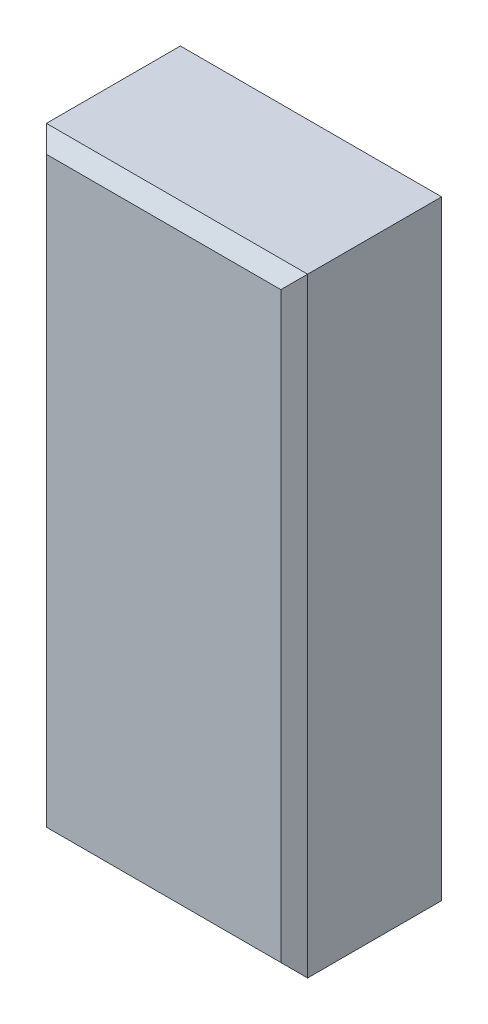
ISO-10303-21;
HEADER;
FILE_DESCRIPTION(('STEP AP214'),'2;1');
FILE_NAME('part.step','',(''),(''),'','','');
FILE_SCHEMA(('AUTOMOTIVE_DESIGN { 1 0 10303 214 1 1 1 1 }'));
ENDSEC;
DATA;
#1=APPLICATION_CONTEXT('core data for automotive mechanical design processes');
#2=APPLICATION_PROTOCOL_DEFINITION('international standard','automotive_design',2000,#1);
#3=PRODUCT_CONTEXT('',#1,'mechanical');
#4=PRODUCT('Part','Part','',(#3));
#5=PRODUCT_RELATED_PRODUCT_CATEGORY('part','',(#4));
#6=PRODUCT_DEFINITION_FORMATION('','',#4);
#7=PRODUCT_DEFINITION_CONTEXT('part definition',#1,'design');
#8=PRODUCT_DEFINITION('design','',#6,#7);
#9=PRODUCT_DEFINITION_SHAPE('','',#8);
#10=(LENGTH_UNIT() NAMED_UNIT(*) SI_UNIT(.MILLI.,.METRE.));
#11=(NAMED_UNIT(*) PLANE_ANGLE_UNIT() SI_UNIT($,.RADIAN.));
#12=(NAMED_UNIT(*) SI_UNIT($,.STERADIAN.) SOLID_ANGLE_UNIT());
#13=UNCERTAINTY_MEASURE_WITH_UNIT(LENGTH_MEASURE(1.E-05),#10,'distance_accuracy_value','');
#14=(GEOMETRIC_REPRESENTATION_CONTEXT(3) GLOBAL_UNCERTAINTY_ASSIGNED_CONTEXT((#13)) GLOBAL_UNIT_ASSIGNED_CONTEXT((#10,
#11,#12)) REPRESENTATION_CONTEXT('',''));
#15=CARTESIAN_POINT('',(0.,0.,0.));
#16=DIRECTION('',(0.,0.,1.));
#17=DIRECTION('',(1.,0.,0.));
#18=AXIS2_PLACEMENT_3D('',#15,#16,#17);
#19=CARTESIAN_POINT('',(9.75,22.75,11.));
#20=DIRECTION('',(-1.,0.,0.));
#21=DIRECTION('',(0.,-1.,0.));
#22=AXIS2_PLACEMENT_3D('',#19,#20,#21);
#23=PLANE('',#22);
#24=DIRECTION('',(0.,0.,-1.));
#25=VECTOR('',#24,1.);
#26=CARTESIAN_POINT('',(9.75,22.75,11.));
#27=LINE('',#26,#25);
#28=CARTESIAN_POINT('',(9.75,22.75,10.));
#29=VERTEX_POINT('',#28);
#30=CARTESIAN_POINT('',(9.75,22.75,0.));
#31=VERTEX_POINT('',#30);
#32=EDGE_CURVE('E88',#29,#31,#27,.T.);
#33=ORIENTED_EDGE('',*,*,#32,.F.);
#34=DIRECTION('',(0.,-1.,0.));
#35=VECTOR('',#34,1.);
#36=CARTESIAN_POINT('',(9.75000000000001,-22.75,10.));
#37=LINE('',#36,#35);
#38=CARTESIAN_POINT('',(9.75000000000001,-22.75,10.));
#39=VERTEX_POINT('',#38);
#40=EDGE_CURVE('E11',#29,#39,#37,.T.);
#41=ORIENTED_EDGE('',*,*,#40,.T.);
#42=DIRECTION('',(0.,0.,-1.));
#43=VECTOR('',#42,1.);
#44=CARTESIAN_POINT('',(9.75000000000001,-22.75,11.));
#45=LINE('',#44,#43);
#46=CARTESIAN_POINT('',(9.75000000000001,-22.75,0.));
#47=VERTEX_POINT('',#46);
#48=EDGE_CURVE('E108',#39,#47,#45,.T.);
#49=ORIENTED_EDGE('',*,*,#48,.T.);
#50=DIRECTION('',(0.,1.,0.));
#51=VECTOR('',#50,1.);
#52=CARTESIAN_POINT('',(9.75,22.75,0.));
#53=LINE('',#52,#51);
#54=EDGE_CURVE('E103',#47,#31,#53,.T.);
#55=ORIENTED_EDGE('',*,*,#54,.T.);
#56=EDGE_LOOP('',(#33,#41,#49,#55));
#57=FACE_BOUND('',#56,.T.);
#58=ADVANCED_FACE('F35',(#57),#23,.F.);
#59=CARTESIAN_POINT('',(-9.75,22.75,11.));
#60=DIRECTION('',(0.,-1.,0.));
#61=DIRECTION('',(0.,0.,-1.));
#62=AXIS2_PLACEMENT_3D('',#59,#60,#61);
#63=PLANE('',#62);
#64=DIRECTION('',(0.,0.,-1.));
#65=VECTOR('',#64,1.);
#66=CARTESIAN_POINT('',(-9.75,22.75,11.));
#67=LINE('',#66,#65);
#68=CARTESIAN_POINT('',(-9.75,22.75,10.));
#69=VERTEX_POINT('',#68);
#70=CARTESIAN_POINT('',(-9.75,22.75,0.));
#71=VERTEX_POINT('',#70);
#72=EDGE_CURVE('E97',#69,#71,#67,.T.);
#73=ORIENTED_EDGE('',*,*,#72,.F.);
#74=DIRECTION('',(1.,0.,0.));
#75=VECTOR('',#74,1.);
#76=CARTESIAN_POINT('',(9.75,22.75,10.));
#77=LINE('',#76,#75);
#78=EDGE_CURVE('E45',#69,#29,#77,.T.);
#79=ORIENTED_EDGE('',*,*,#78,.T.);
#80=ORIENTED_EDGE('',*,*,#32,.T.);
#81=DIRECTION('',(-1.,0.,0.));
#82=VECTOR('',#81,1.);
#83=CARTESIAN_POINT('',(-9.75,22.75,0.));
#84=LINE('',#83,#82);
#85=EDGE_CURVE('E91',#31,#71,#84,.T.);
#86=ORIENTED_EDGE('',*,*,#85,.T.);
#87=EDGE_LOOP('',(#73,#79,#80,#86));
#88=FACE_BOUND('',#87,.T.);
#89=ADVANCED_FACE('F90',(#88),#63,.F.);
#90=CARTESIAN_POINT('',(-9.75,22.75,11.));
#91=DIRECTION('',(1.,0.,0.));
#92=DIRECTION('',(0.,1.,0.));
#93=AXIS2_PLACEMENT_3D('',#90,#91,#92);
#94=PLANE('',#93);
#95=DIRECTION('',(0.,0.,-1.));
#96=VECTOR('',#95,1.);
#97=CARTESIAN_POINT('',(-9.74999999999999,-22.75,11.));
#98=LINE('',#97,#96);
#99=CARTESIAN_POINT('',(-9.74999999999999,-22.75,10.));
#100=VERTEX_POINT('',#99);
#101=CARTESIAN_POINT('',(-9.74999999999999,-22.75,0.));
#102=VERTEX_POINT('',#101);
#103=EDGE_CURVE('E118',#100,#102,#98,.T.);
#104=ORIENTED_EDGE('',*,*,#103,.F.);
#105=DIRECTION('',(0.,1.,0.));
#106=VECTOR('',#105,1.);
#107=CARTESIAN_POINT('',(-9.75,22.75,10.));
#108=LINE('',#107,#106);
#109=EDGE_CURVE('E60',#100,#69,#108,.T.);
#110=ORIENTED_EDGE('',*,*,#109,.T.);
#111=ORIENTED_EDGE('',*,*,#72,.T.);
#112=DIRECTION('',(0.,-1.,0.));
#113=VECTOR('',#112,1.);
#114=CARTESIAN_POINT('',(-9.75,22.75,0.));
#115=LINE('',#114,#113);
#116=EDGE_CURVE('E105',#71,#102,#115,.T.);
#117=ORIENTED_EDGE('',*,*,#116,.T.);
#118=EDGE_LOOP('',(#104,#110,#111,#117));
#119=FACE_BOUND('',#118,.T.);
#120=ADVANCED_FACE('F156',(#119),#94,.F.);
#121=CARTESIAN_POINT('',(-9.74999999999999,-22.75,11.));
#122=DIRECTION('',(0.,1.,0.));
#123=DIRECTION('',(0.,0.,1.));
#124=AXIS2_PLACEMENT_3D('',#121,#122,#123);
#125=PLANE('',#124);
#126=ORIENTED_EDGE('',*,*,#48,.F.);
#127=DIRECTION('',(-1.,0.,0.));
#128=VECTOR('',#127,1.);
#129=CARTESIAN_POINT('',(-9.74999999999999,-22.75,10.));
#130=LINE('',#129,#128);
#131=EDGE_CURVE('E129',#39,#100,#130,.T.);
#132=ORIENTED_EDGE('',*,*,#131,.T.);
#133=ORIENTED_EDGE('',*,*,#103,.T.);
#134=DIRECTION('',(1.,0.,0.));
#135=VECTOR('',#134,1.);
#136=CARTESIAN_POINT('',(-9.74999999999999,-22.75,0.));
#137=LINE('',#136,#135);
#138=EDGE_CURVE('E115',#102,#47,#137,.T.);
#139=ORIENTED_EDGE('',*,*,#138,.T.);
#140=EDGE_LOOP('',(#126,#132,#133,#139));
#141=FACE_BOUND('',#140,.T.);
#142=ADVANCED_FACE('F155',(#141),#125,.F.);
#143=CARTESIAN_POINT('',(0.,0.,11.));
#144=DIRECTION('',(0.,0.,1.));
#145=DIRECTION('',(1.,0.,0.));
#146=AXIS2_PLACEMENT_3D('',#143,#144,#145);
#147=PLANE('',#146);
#148=DIRECTION('',(0.,-1.,0.));
#149=VECTOR('',#148,1.);
#150=CARTESIAN_POINT('',(-8.75,-22.75,11.));
#151=LINE('',#150,#149);
#152=CARTESIAN_POINT('',(-8.75,21.75,11.));
#153=VERTEX_POINT('',#152);
#154=CARTESIAN_POINT('',(-8.75,-21.75,11.));
#155=VERTEX_POINT('',#154);
#156=EDGE_CURVE('E124',#153,#155,#151,.T.);
#157=ORIENTED_EDGE('',*,*,#156,.T.);
#158=DIRECTION('',(1.,0.,0.));
#159=VECTOR('',#158,1.);
#160=CARTESIAN_POINT('',(9.75000000000001,-21.75,11.));
#161=LINE('',#160,#159);
#162=CARTESIAN_POINT('',(8.75,-21.75,11.));
#163=VERTEX_POINT('',#162);
#164=EDGE_CURVE('E126',#155,#163,#161,.T.);
#165=ORIENTED_EDGE('',*,*,#164,.T.);
#166=DIRECTION('',(0.,1.,0.));
#167=VECTOR('',#166,1.);
#168=CARTESIAN_POINT('',(8.75,22.75,11.));
#169=LINE('',#168,#167);
#170=CARTESIAN_POINT('',(8.75,21.75,11.));
#171=VERTEX_POINT('',#170);
#172=EDGE_CURVE('E96',#163,#171,#169,.T.);
#173=ORIENTED_EDGE('',*,*,#172,.T.);
#174=DIRECTION('',(-1.,0.,0.));
#175=VECTOR('',#174,1.);
#176=CARTESIAN_POINT('',(-9.75,21.75,11.));
#177=LINE('',#176,#175);
#178=EDGE_CURVE('E122',#171,#153,#177,.T.);
#179=ORIENTED_EDGE('',*,*,#178,.T.);
#180=EDGE_LOOP('',(#157,#165,#173,#179));
#181=FACE_BOUND('',#180,.T.);
#182=ADVANCED_FACE('F148',(#181),#147,.T.);
#183=CARTESIAN_POINT('',(0.,0.,0.));
#184=DIRECTION('',(0.,0.,1.));
#185=DIRECTION('',(1.,0.,0.));
#186=AXIS2_PLACEMENT_3D('',#183,#184,#185);
#187=PLANE('',#186);
#188=ORIENTED_EDGE('',*,*,#54,.F.);
#189=ORIENTED_EDGE('',*,*,#138,.F.);
#190=ORIENTED_EDGE('',*,*,#116,.F.);
#191=ORIENTED_EDGE('',*,*,#85,.F.);
#192=EDGE_LOOP('',(#188,#189,#190,#191));
#193=FACE_BOUND('',#192,.T.);
#194=ADVANCED_FACE('F101',(#193),#187,.F.);
#195=CARTESIAN_POINT('',(0.,21.75,11.));
#196=DIRECTION('',(0.,0.707106781186547,0.707106781186547));
#197=DIRECTION('',(1.,0.,0.));
#198=AXIS2_PLACEMENT_3D('',#195,#196,#197);
#199=PLANE('',#198);
#200=DIRECTION('',(-0.577350269189627,-0.577350269189625,0.577350269189625));
#201=VECTOR('',#200,1.);
#202=CARTESIAN_POINT('',(1.49999999999999,14.5,18.25));
#203=LINE('',#202,#201);
#204=EDGE_CURVE('E112',#29,#171,#203,.T.);
#205=ORIENTED_EDGE('',*,*,#204,.F.);
#206=ORIENTED_EDGE('',*,*,#78,.F.);
#207=DIRECTION('',(0.577350269189625,-0.577350269189626,0.577350269189626));
#208=VECTOR('',#207,1.);
#209=CARTESIAN_POINT('',(-5.83333333333335,18.8333333333333,13.9166666666667));
#210=LINE('',#209,#208);
#211=EDGE_CURVE('E40',#153,#69,#210,.F.);
#212=ORIENTED_EDGE('',*,*,#211,.F.);
#213=ORIENTED_EDGE('',*,*,#178,.F.);
#214=EDGE_LOOP('',(#205,#206,#212,#213));
#215=FACE_BOUND('',#214,.T.);
#216=ADVANCED_FACE('F38',(#215),#199,.T.);
#217=CARTESIAN_POINT('',(-8.75,0.,11.));
#218=DIRECTION('',(-0.707106781186548,0.,0.707106781186547));
#219=DIRECTION('',(0.,1.,0.));
#220=AXIS2_PLACEMENT_3D('',#217,#218,#219);
#221=PLANE('',#220);
#222=ORIENTED_EDGE('',*,*,#211,.T.);
#223=ORIENTED_EDGE('',*,*,#109,.F.);
#224=DIRECTION('',(0.577350269189625,0.577350269189626,0.577350269189626));
#225=VECTOR('',#224,1.);
#226=CARTESIAN_POINT('',(-1.5,-14.5,18.25));
#227=LINE('',#226,#225);
#228=EDGE_CURVE('E136',#155,#100,#227,.F.);
#229=ORIENTED_EDGE('',*,*,#228,.F.);
#230=ORIENTED_EDGE('',*,*,#156,.F.);
#231=EDGE_LOOP('',(#222,#223,#229,#230));
#232=FACE_BOUND('',#231,.T.);
#233=ADVANCED_FACE('F180',(#232),#221,.T.);
#234=CARTESIAN_POINT('',(8.75,0.,11.));
#235=DIRECTION('',(0.707106781186547,0.,0.707106781186549));
#236=DIRECTION('',(0.,-1.,0.));
#237=AXIS2_PLACEMENT_3D('',#234,#235,#236);
#238=PLANE('',#237);
#239=ORIENTED_EDGE('',*,*,#204,.T.);
#240=ORIENTED_EDGE('',*,*,#172,.F.);
#241=DIRECTION('',(0.577350269189627,-0.577350269189625,-0.577350269189625));
#242=VECTOR('',#241,1.);
#243=CARTESIAN_POINT('',(1.49999999999999,-14.5,18.25));
#244=LINE('',#243,#242);
#245=EDGE_CURVE('E134',#39,#163,#244,.F.);
#246=ORIENTED_EDGE('',*,*,#245,.F.);
#247=ORIENTED_EDGE('',*,*,#40,.F.);
#248=EDGE_LOOP('',(#239,#240,#246,#247));
#249=FACE_BOUND('',#248,.T.);
#250=ADVANCED_FACE('F141',(#249),#238,.T.);
#251=CARTESIAN_POINT('',(0.,-21.75,11.));
#252=DIRECTION('',(0.,-0.707106781186547,0.707106781186547));
#253=DIRECTION('',(-1.,0.,0.));
#254=AXIS2_PLACEMENT_3D('',#251,#252,#253);
#255=PLANE('',#254);
#256=ORIENTED_EDGE('',*,*,#228,.T.);
#257=ORIENTED_EDGE('',*,*,#131,.F.);
#258=ORIENTED_EDGE('',*,*,#245,.T.);
#259=ORIENTED_EDGE('',*,*,#164,.F.);
#260=EDGE_LOOP('',(#256,#257,#258,#259));
#261=FACE_BOUND('',#260,.T.);
#262=ADVANCED_FACE('F152',(#261),#255,.T.);
#263=CLOSED_SHELL('',(#58,#89,#120,#142,#182,#194,#216,#233,#250,#262));
#264=MANIFOLD_SOLID_BREP('B2',#263);
#265=ADVANCED_BREP_SHAPE_REPRESENTATION('',(#18,#264),#14);
#266=SHAPE_DEFINITION_REPRESENTATION(#9,#265);
ENDSEC;
END-ISO-10303-21;
